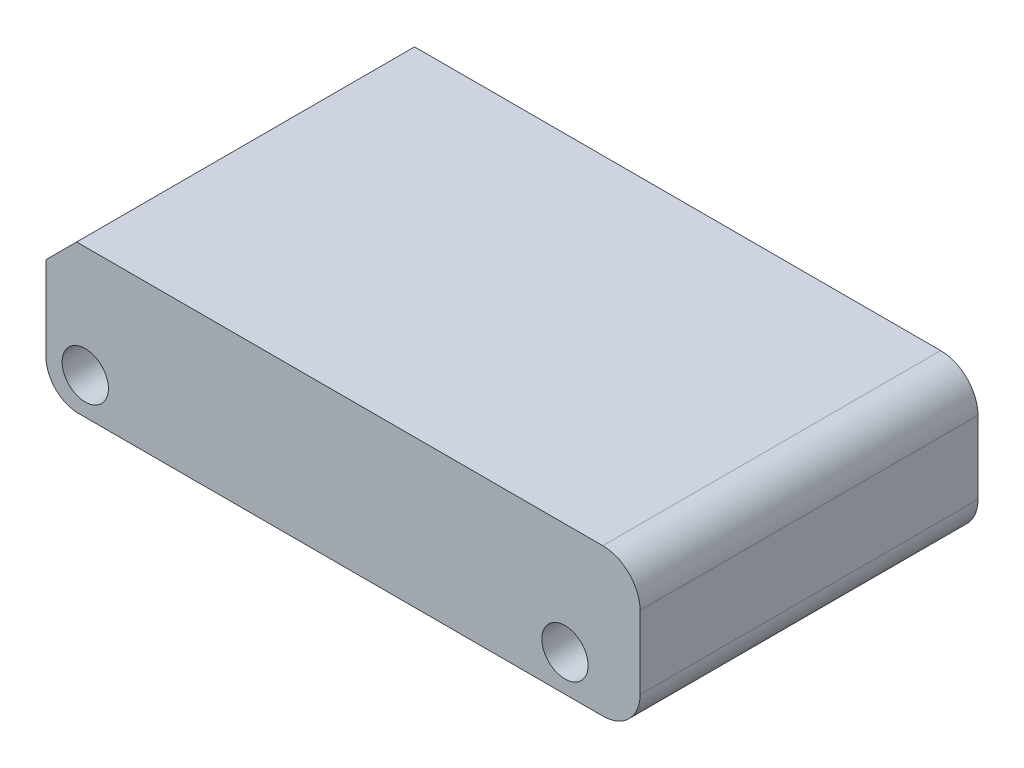
ISO-10303-21;
HEADER;
FILE_DESCRIPTION(('STEP AP214'),'2;1');
FILE_NAME('part.step','',(''),(''),'','','');
FILE_SCHEMA(('AUTOMOTIVE_DESIGN { 1 0 10303 214 1 1 1 1 }'));
ENDSEC;
DATA;
#1=APPLICATION_CONTEXT('core data for automotive mechanical design processes');
#2=APPLICATION_PROTOCOL_DEFINITION('international standard','automotive_design',2000,#1);
#3=PRODUCT_CONTEXT('',#1,'mechanical');
#4=PRODUCT('Part','Part','',(#3));
#5=PRODUCT_RELATED_PRODUCT_CATEGORY('part','',(#4));
#6=PRODUCT_DEFINITION_FORMATION('','',#4);
#7=PRODUCT_DEFINITION_CONTEXT('part definition',#1,'design');
#8=PRODUCT_DEFINITION('design','',#6,#7);
#9=PRODUCT_DEFINITION_SHAPE('','',#8);
#10=(LENGTH_UNIT() NAMED_UNIT(*) SI_UNIT(.MILLI.,.METRE.));
#11=(NAMED_UNIT(*) PLANE_ANGLE_UNIT() SI_UNIT($,.RADIAN.));
#12=(NAMED_UNIT(*) SI_UNIT($,.STERADIAN.) SOLID_ANGLE_UNIT());
#13=UNCERTAINTY_MEASURE_WITH_UNIT(LENGTH_MEASURE(1.E-05),#10,'distance_accuracy_value','');
#14=(GEOMETRIC_REPRESENTATION_CONTEXT(3) GLOBAL_UNCERTAINTY_ASSIGNED_CONTEXT((#13)) GLOBAL_UNIT_ASSIGNED_CONTEXT((#10,
#11,#12)) REPRESENTATION_CONTEXT('',''));
#15=CARTESIAN_POINT('',(0.,0.,0.));
#16=DIRECTION('',(0.,0.,1.));
#17=DIRECTION('',(1.,0.,0.));
#18=AXIS2_PLACEMENT_3D('',#15,#16,#17);
#19=CARTESIAN_POINT('',(-88.8711953616352,30.9117201257862,-93.9800000000003));
#20=DIRECTION('',(-0.707106781186548,0.707106781186548,0.));
#21=DIRECTION('',(-0.707106781186548,-0.707106781186548,0.));
#22=AXIS2_PLACEMENT_3D('',#19,#20,#21);
#23=PLANE('',#22);
#24=DIRECTION('',(-0.707106781186548,-0.707106781186548,0.));
#25=VECTOR('',#24,1.);
#26=CARTESIAN_POINT('',(-88.8711953616352,30.9117201257862,0.));
#27=LINE('',#26,#25);
#28=CARTESIAN_POINT('',(-88.8711953616352,30.9117201257862,0.));
#29=VERTEX_POINT('',#28);
#30=CARTESIAN_POINT('',(-97.3875249057969,22.3953905816245,0.));
#31=VERTEX_POINT('',#30);
#32=EDGE_CURVE('E142',#29,#31,#27,.T.);
#33=ORIENTED_EDGE('',*,*,#32,.F.);
#34=DIRECTION('',(0.,0.,1.));
#35=VECTOR('',#34,1.);
#36=CARTESIAN_POINT('',(-88.8711953616352,30.9117201257862,-93.9800000000003));
#37=LINE('',#36,#35);
#38=CARTESIAN_POINT('',(-88.8711953616352,30.9117201257862,-93.9800000000003));
#39=VERTEX_POINT('',#38);
#40=EDGE_CURVE('E11',#39,#29,#37,.T.);
#41=ORIENTED_EDGE('',*,*,#40,.F.);
#42=DIRECTION('',(-0.707106781186548,-0.707106781186548,0.));
#43=VECTOR('',#42,1.);
#44=CARTESIAN_POINT('',(-88.8711953616352,30.9117201257862,-93.9800000000003));
#45=LINE('',#44,#43);
#46=CARTESIAN_POINT('',(-97.3875249057969,22.3953905816245,-93.9800000000003));
#47=VERTEX_POINT('',#46);
#48=EDGE_CURVE('E171',#39,#47,#45,.T.);
#49=ORIENTED_EDGE('',*,*,#48,.T.);
#50=DIRECTION('',(0.,0.,1.));
#51=VECTOR('',#50,1.);
#52=CARTESIAN_POINT('',(-97.3875249057969,22.3953905816245,-93.9800000000003));
#53=LINE('',#52,#51);
#54=EDGE_CURVE('E42',#47,#31,#53,.T.);
#55=ORIENTED_EDGE('',*,*,#54,.T.);
#56=EDGE_LOOP('',(#33,#41,#49,#55));
#57=FACE_BOUND('',#56,.T.);
#58=ADVANCED_FACE('F39',(#57),#23,.T.);
#59=CARTESIAN_POINT('',(-88.8711953616352,30.9117201257862,-93.9800000000003));
#60=DIRECTION('',(0.,1.,0.));
#61=DIRECTION('',(0.,0.,1.));
#62=AXIS2_PLACEMENT_3D('',#59,#60,#61);
#63=PLANE('',#62);
#64=DIRECTION('',(-1.,0.,0.));
#65=VECTOR('',#64,1.);
#66=CARTESIAN_POINT('',(-88.8711953616352,30.9117201257862,0.));
#67=LINE('',#66,#65);
#68=CARTESIAN_POINT('',(57.4375560690458,30.9117201257862,0.));
#69=VERTEX_POINT('',#68);
#70=EDGE_CURVE('E168',#69,#29,#67,.T.);
#71=ORIENTED_EDGE('',*,*,#70,.F.);
#72=DIRECTION('',(0.,0.,1.));
#73=VECTOR('',#72,1.);
#74=CARTESIAN_POINT('',(57.4375560690458,30.9117201257862,-93.9800000000003));
#75=LINE('',#74,#73);
#76=CARTESIAN_POINT('',(57.4375560690458,30.9117201257862,-93.9800000000003));
#77=VERTEX_POINT('',#76);
#78=EDGE_CURVE('E49',#77,#69,#75,.T.);
#79=ORIENTED_EDGE('',*,*,#78,.F.);
#80=DIRECTION('',(-1.,0.,0.));
#81=VECTOR('',#80,1.);
#82=CARTESIAN_POINT('',(-88.8711953616352,30.9117201257862,-93.9800000000003));
#83=LINE('',#82,#81);
#84=EDGE_CURVE('E128',#77,#39,#83,.T.);
#85=ORIENTED_EDGE('',*,*,#84,.T.);
#86=ORIENTED_EDGE('',*,*,#40,.T.);
#87=EDGE_LOOP('',(#71,#79,#85,#86));
#88=FACE_BOUND('',#87,.T.);
#89=ADVANCED_FACE('F189',(#88),#63,.T.);
#90=CARTESIAN_POINT('',(57.4375560690459,20.5300281602409,-93.9800000000003));
#91=DIRECTION('',(0.,0.,1.));
#92=DIRECTION('',(1.,0.,0.));
#93=AXIS2_PLACEMENT_3D('',#90,#91,#92);
#94=CYLINDRICAL_SURFACE('',#93,10.3816919655453);
#95=CARTESIAN_POINT('',(57.4375560690459,20.5300281602409,0.));
#96=DIRECTION('',(0.,0.,1.));
#97=DIRECTION('',(-1.,0.,0.));
#98=AXIS2_PLACEMENT_3D('',#95,#96,#97);
#99=CIRCLE('',#98,10.3816919655453);
#100=CARTESIAN_POINT('',(67.8192480345912,20.5300281602408,0.));
#101=VERTEX_POINT('',#100);
#102=EDGE_CURVE('E114',#101,#69,#99,.T.);
#103=ORIENTED_EDGE('',*,*,#102,.F.);
#104=DIRECTION('',(0.,0.,1.));
#105=VECTOR('',#104,1.);
#106=CARTESIAN_POINT('',(67.8192480345912,20.5300281602408,-93.9800000000003));
#107=LINE('',#106,#105);
#108=CARTESIAN_POINT('',(67.8192480345912,20.5300281602408,-93.9800000000003));
#109=VERTEX_POINT('',#108);
#110=EDGE_CURVE('E109',#109,#101,#107,.T.);
#111=ORIENTED_EDGE('',*,*,#110,.F.);
#112=CARTESIAN_POINT('',(57.4375560690459,20.5300281602409,-93.9800000000003));
#113=DIRECTION('',(0.,0.,1.));
#114=DIRECTION('',(-1.,0.,0.));
#115=AXIS2_PLACEMENT_3D('',#112,#113,#114);
#116=CIRCLE('',#115,10.3816919655453);
#117=EDGE_CURVE('E112',#109,#77,#116,.T.);
#118=ORIENTED_EDGE('',*,*,#117,.T.);
#119=ORIENTED_EDGE('',*,*,#78,.T.);
#120=EDGE_LOOP('',(#103,#111,#118,#119));
#121=FACE_BOUND('',#120,.T.);
#122=ADVANCED_FACE('F111',(#121),#94,.T.);
#123=CARTESIAN_POINT('',(67.8192480345912,20.5300281602408,-93.9800000000003));
#124=DIRECTION('',(1.,0.,0.));
#125=DIRECTION('',(0.,0.,-1.));
#126=AXIS2_PLACEMENT_3D('',#123,#124,#125);
#127=PLANE('',#126);
#128=DIRECTION('',(0.,1.,0.));
#129=VECTOR('',#128,1.);
#130=CARTESIAN_POINT('',(67.8192480345912,20.5300281602408,0.));
#131=LINE('',#130,#129);
#132=CARTESIAN_POINT('',(67.8192480345912,0.255438820891287,0.));
#133=VERTEX_POINT('',#132);
#134=EDGE_CURVE('E163',#133,#101,#131,.T.);
#135=ORIENTED_EDGE('',*,*,#134,.F.);
#136=DIRECTION('',(0.,0.,1.));
#137=VECTOR('',#136,1.);
#138=CARTESIAN_POINT('',(67.8192480345912,0.255438820891287,-93.9800000000003));
#139=LINE('',#138,#137);
#140=CARTESIAN_POINT('',(67.8192480345912,0.255438820891287,-93.9800000000003));
#141=VERTEX_POINT('',#140);
#142=EDGE_CURVE('E120',#141,#133,#139,.T.);
#143=ORIENTED_EDGE('',*,*,#142,.F.);
#144=DIRECTION('',(0.,1.,0.));
#145=VECTOR('',#144,1.);
#146=CARTESIAN_POINT('',(67.8192480345912,20.5300281602408,-93.9800000000003));
#147=LINE('',#146,#145);
#148=EDGE_CURVE('E126',#141,#109,#147,.T.);
#149=ORIENTED_EDGE('',*,*,#148,.T.);
#150=ORIENTED_EDGE('',*,*,#110,.T.);
#151=EDGE_LOOP('',(#135,#143,#149,#150));
#152=FACE_BOUND('',#151,.T.);
#153=ADVANCED_FACE('F131',(#152),#127,.T.);
#154=CARTESIAN_POINT('',(57.4375560690459,0.255438820891211,-93.9800000000003));
#155=DIRECTION('',(0.,0.,1.));
#156=DIRECTION('',(1.,0.,0.));
#157=AXIS2_PLACEMENT_3D('',#154,#155,#156);
#158=CYLINDRICAL_SURFACE('',#157,10.3816919655453);
#159=CARTESIAN_POINT('',(57.4375560690459,0.255438820891211,0.));
#160=DIRECTION('',(0.,0.,1.));
#161=DIRECTION('',(1.,0.,0.));
#162=AXIS2_PLACEMENT_3D('',#159,#160,#161);
#163=CIRCLE('',#162,10.3816919655453);
#164=CARTESIAN_POINT('',(57.4375560690458,-10.1262531446541,0.));
#165=VERTEX_POINT('',#164);
#166=EDGE_CURVE('E159',#165,#133,#163,.T.);
#167=ORIENTED_EDGE('',*,*,#166,.F.);
#168=DIRECTION('',(0.,0.,1.));
#169=VECTOR('',#168,1.);
#170=CARTESIAN_POINT('',(57.4375560690458,-10.1262531446541,-93.9800000000003));
#171=LINE('',#170,#169);
#172=CARTESIAN_POINT('',(57.4375560690458,-10.1262531446541,-93.9800000000003));
#173=VERTEX_POINT('',#172);
#174=EDGE_CURVE('E177',#173,#165,#171,.T.);
#175=ORIENTED_EDGE('',*,*,#174,.F.);
#176=CARTESIAN_POINT('',(57.4375560690459,0.255438820891211,-93.9800000000003));
#177=DIRECTION('',(0.,0.,1.));
#178=DIRECTION('',(1.,0.,0.));
#179=AXIS2_PLACEMENT_3D('',#176,#177,#178);
#180=CIRCLE('',#179,10.3816919655453);
#181=EDGE_CURVE('E133',#173,#141,#180,.T.);
#182=ORIENTED_EDGE('',*,*,#181,.T.);
#183=ORIENTED_EDGE('',*,*,#142,.T.);
#184=EDGE_LOOP('',(#167,#175,#182,#183));
#185=FACE_BOUND('',#184,.T.);
#186=ADVANCED_FACE('F202',(#185),#158,.T.);
#187=CARTESIAN_POINT('',(-88.3271931447905,-10.1262531446541,-93.9800000000003));
#188=DIRECTION('',(0.,-1.,0.));
#189=DIRECTION('',(1.,0.,0.));
#190=AXIS2_PLACEMENT_3D('',#187,#188,#189);
#191=PLANE('',#190);
#192=DIRECTION('',(1.,0.,0.));
#193=VECTOR('',#192,1.);
#194=CARTESIAN_POINT('',(-88.3271931447905,-10.1262531446541,0.));
#195=LINE('',#194,#193);
#196=CARTESIAN_POINT('',(-88.3271931447905,-10.1262531446541,0.));
#197=VERTEX_POINT('',#196);
#198=EDGE_CURVE('E155',#197,#165,#195,.T.);
#199=ORIENTED_EDGE('',*,*,#198,.F.);
#200=DIRECTION('',(0.,0.,1.));
#201=VECTOR('',#200,1.);
#202=CARTESIAN_POINT('',(-88.3271931447905,-10.1262531446541,-93.9800000000003));
#203=LINE('',#202,#201);
#204=CARTESIAN_POINT('',(-88.3271931447905,-10.1262531446541,-93.9800000000003));
#205=VERTEX_POINT('',#204);
#206=EDGE_CURVE('E180',#205,#197,#203,.T.);
#207=ORIENTED_EDGE('',*,*,#206,.F.);
#208=DIRECTION('',(1.,0.,0.));
#209=VECTOR('',#208,1.);
#210=CARTESIAN_POINT('',(-88.3271931447905,-10.1262531446541,-93.9800000000003));
#211=LINE('',#210,#209);
#212=EDGE_CURVE('E136',#205,#173,#211,.T.);
#213=ORIENTED_EDGE('',*,*,#212,.T.);
#214=ORIENTED_EDGE('',*,*,#174,.T.);
#215=EDGE_LOOP('',(#199,#207,#213,#214));
#216=FACE_BOUND('',#215,.T.);
#217=ADVANCED_FACE('F205',(#216),#191,.T.);
#218=CARTESIAN_POINT('',(-88.3271931447905,-1.06592138364773,-93.9800000000003));
#219=DIRECTION('',(0.,0.,1.));
#220=DIRECTION('',(1.,0.,0.));
#221=AXIS2_PLACEMENT_3D('',#218,#219,#220);
#222=CYLINDRICAL_SURFACE('',#221,9.06033176100637);
#223=CARTESIAN_POINT('',(-88.3271931447905,-1.06592138364773,0.));
#224=DIRECTION('',(0.,0.,1.));
#225=DIRECTION('',(1.,0.,0.));
#226=AXIS2_PLACEMENT_3D('',#223,#224,#225);
#227=CIRCLE('',#226,9.06033176100637);
#228=CARTESIAN_POINT('',(-97.3875249057969,-1.06592138364773,0.));
#229=VERTEX_POINT('',#228);
#230=EDGE_CURVE('E151',#229,#197,#227,.T.);
#231=ORIENTED_EDGE('',*,*,#230,.F.);
#232=DIRECTION('',(0.,0.,1.));
#233=VECTOR('',#232,1.);
#234=CARTESIAN_POINT('',(-97.3875249057969,-1.06592138364773,-93.9800000000003));
#235=LINE('',#234,#233);
#236=CARTESIAN_POINT('',(-97.3875249057969,-1.06592138364773,-93.9800000000003));
#237=VERTEX_POINT('',#236);
#238=EDGE_CURVE('E182',#237,#229,#235,.T.);
#239=ORIENTED_EDGE('',*,*,#238,.F.);
#240=CARTESIAN_POINT('',(-88.3271931447905,-1.06592138364773,-93.9800000000003));
#241=DIRECTION('',(0.,0.,1.));
#242=DIRECTION('',(1.,0.,0.));
#243=AXIS2_PLACEMENT_3D('',#240,#241,#242);
#244=CIRCLE('',#243,9.06033176100637);
#245=EDGE_CURVE('E257',#237,#205,#244,.T.);
#246=ORIENTED_EDGE('',*,*,#245,.T.);
#247=ORIENTED_EDGE('',*,*,#206,.T.);
#248=EDGE_LOOP('',(#231,#239,#246,#247));
#249=FACE_BOUND('',#248,.T.);
#250=ADVANCED_FACE('F209',(#249),#222,.T.);
#251=CARTESIAN_POINT('',(-97.3875249057969,22.3953905816245,-93.9800000000003));
#252=DIRECTION('',(-1.,0.,0.));
#253=DIRECTION('',(0.,0.,1.));
#254=AXIS2_PLACEMENT_3D('',#251,#252,#253);
#255=PLANE('',#254);
#256=DIRECTION('',(0.,-1.,0.));
#257=VECTOR('',#256,1.);
#258=CARTESIAN_POINT('',(-97.3875249057969,22.3953905816245,0.));
#259=LINE('',#258,#257);
#260=EDGE_CURVE('E146',#31,#229,#259,.T.);
#261=ORIENTED_EDGE('',*,*,#260,.F.);
#262=ORIENTED_EDGE('',*,*,#54,.F.);
#263=DIRECTION('',(0.,-1.,0.));
#264=VECTOR('',#263,1.);
#265=CARTESIAN_POINT('',(-97.3875249057969,22.3953905816245,-93.9800000000003));
#266=LINE('',#265,#264);
#267=EDGE_CURVE('E254',#47,#237,#266,.T.);
#268=ORIENTED_EDGE('',*,*,#267,.T.);
#269=ORIENTED_EDGE('',*,*,#238,.T.);
#270=EDGE_LOOP('',(#261,#262,#268,#269));
#271=FACE_BOUND('',#270,.T.);
#272=ADVANCED_FACE('F186',(#271),#255,.T.);
#273=CARTESIAN_POINT('',(-88.3271931447905,-1.06592138364773,-93.9800000000003));
#274=DIRECTION('',(0.,0.,1.));
#275=DIRECTION('',(1.,0.,0.));
#276=AXIS2_PLACEMENT_3D('',#273,#274,#275);
#277=PLANE('',#276);
#278=CARTESIAN_POINT('',(46.9390647327295,0.,-93.9800000000003));
#279=DIRECTION('',(0.,0.,1.));
#280=DIRECTION('',(1.,0.,0.));
#281=AXIS2_PLACEMENT_3D('',#278,#279,#280);
#282=CIRCLE('',#281,6.43978854142695);
#283=CARTESIAN_POINT('',(53.3788532741565,0.,-93.9800000000003));
#284=VERTEX_POINT('',#283);
#285=EDGE_CURVE('E236',#284,#284,#282,.T.);
#286=ORIENTED_EDGE('',*,*,#285,.T.);
#287=EDGE_LOOP('',(#286));
#288=FACE_BOUND('',#287,.T.);
#289=CARTESIAN_POINT('',(-86.4728722484277,0.,-93.9800000000003));
#290=DIRECTION('',(0.,0.,1.));
#291=DIRECTION('',(1.,0.,0.));
#292=AXIS2_PLACEMENT_3D('',#289,#290,#291);
#293=CIRCLE('',#292,6.43978854142695);
#294=CARTESIAN_POINT('',(-80.0330837070007,0.,-93.9800000000003));
#295=VERTEX_POINT('',#294);
#296=EDGE_CURVE('E147',#295,#295,#293,.T.);
#297=ORIENTED_EDGE('',*,*,#296,.T.);
#298=EDGE_LOOP('',(#297));
#299=FACE_BOUND('',#298,.T.);
#300=ORIENTED_EDGE('',*,*,#48,.F.);
#301=ORIENTED_EDGE('',*,*,#84,.F.);
#302=ORIENTED_EDGE('',*,*,#117,.F.);
#303=ORIENTED_EDGE('',*,*,#148,.F.);
#304=ORIENTED_EDGE('',*,*,#181,.F.);
#305=ORIENTED_EDGE('',*,*,#212,.F.);
#306=ORIENTED_EDGE('',*,*,#245,.F.);
#307=ORIENTED_EDGE('',*,*,#267,.F.);
#308=EDGE_LOOP('',(#300,#301,#302,#303,#304,#305,#306,#307));
#309=FACE_BOUND('',#308,.T.);
#310=ADVANCED_FACE('F124',(#288,#299,#309),#277,.F.);
#311=CARTESIAN_POINT('',(-88.3271931447905,-1.06592138364773,0.));
#312=DIRECTION('',(0.,0.,1.));
#313=DIRECTION('',(1.,0.,0.));
#314=AXIS2_PLACEMENT_3D('',#311,#312,#313);
#315=PLANE('',#314);
#316=CARTESIAN_POINT('',(46.9390647327295,0.,0.));
#317=DIRECTION('',(0.,0.,1.));
#318=DIRECTION('',(1.,0.,0.));
#319=AXIS2_PLACEMENT_3D('',#316,#317,#318);
#320=CIRCLE('',#319,6.43978854142695);
#321=CARTESIAN_POINT('',(53.3788532741565,0.,0.));
#322=VERTEX_POINT('',#321);
#323=EDGE_CURVE('E239',#322,#322,#320,.T.);
#324=ORIENTED_EDGE('',*,*,#323,.F.);
#325=EDGE_LOOP('',(#324));
#326=FACE_BOUND('',#325,.T.);
#327=CARTESIAN_POINT('',(-86.4728722484277,0.,0.));
#328=DIRECTION('',(0.,0.,1.));
#329=DIRECTION('',(1.,0.,0.));
#330=AXIS2_PLACEMENT_3D('',#327,#328,#329);
#331=CIRCLE('',#330,6.43978854142695);
#332=CARTESIAN_POINT('',(-80.0330837070007,0.,0.));
#333=VERTEX_POINT('',#332);
#334=EDGE_CURVE('E243',#333,#333,#331,.T.);
#335=ORIENTED_EDGE('',*,*,#334,.F.);
#336=EDGE_LOOP('',(#335));
#337=FACE_BOUND('',#336,.T.);
#338=ORIENTED_EDGE('',*,*,#32,.T.);
#339=ORIENTED_EDGE('',*,*,#260,.T.);
#340=ORIENTED_EDGE('',*,*,#230,.T.);
#341=ORIENTED_EDGE('',*,*,#198,.T.);
#342=ORIENTED_EDGE('',*,*,#166,.T.);
#343=ORIENTED_EDGE('',*,*,#134,.T.);
#344=ORIENTED_EDGE('',*,*,#102,.T.);
#345=ORIENTED_EDGE('',*,*,#70,.T.);
#346=EDGE_LOOP('',(#338,#339,#340,#341,#342,#343,#344,#345));
#347=FACE_BOUND('',#346,.T.);
#348=ADVANCED_FACE('F188',(#326,#337,#347),#315,.T.);
#349=CARTESIAN_POINT('',(-86.4728722484277,0.,-93.9800000000003));
#350=DIRECTION('',(0.,0.,1.));
#351=DIRECTION('',(1.,0.,0.));
#352=AXIS2_PLACEMENT_3D('',#349,#350,#351);
#353=CYLINDRICAL_SURFACE('',#352,6.43978854142695);
#354=ORIENTED_EDGE('',*,*,#296,.F.);
#355=EDGE_LOOP('',(#354));
#356=FACE_BOUND('',#355,.T.);
#357=ORIENTED_EDGE('',*,*,#334,.T.);
#358=EDGE_LOOP('',(#357));
#359=FACE_BOUND('',#358,.T.);
#360=ADVANCED_FACE('F221',(#356,#359),#353,.F.);
#361=CARTESIAN_POINT('',(46.9390647327295,0.,-93.9800000000003));
#362=DIRECTION('',(0.,0.,1.));
#363=DIRECTION('',(1.,0.,0.));
#364=AXIS2_PLACEMENT_3D('',#361,#362,#363);
#365=CYLINDRICAL_SURFACE('',#364,6.43978854142695);
#366=ORIENTED_EDGE('',*,*,#285,.F.);
#367=EDGE_LOOP('',(#366));
#368=FACE_BOUND('',#367,.T.);
#369=ORIENTED_EDGE('',*,*,#323,.T.);
#370=EDGE_LOOP('',(#369));
#371=FACE_BOUND('',#370,.T.);
#372=ADVANCED_FACE('F228',(#368,#371),#365,.F.);
#373=CLOSED_SHELL('',(#58,#89,#122,#153,#186,#217,#250,#272,#310,#348,#360,#372));
#374=MANIFOLD_SOLID_BREP('B2',#373);
#375=ADVANCED_BREP_SHAPE_REPRESENTATION('',(#18,#374),#14);
#376=SHAPE_DEFINITION_REPRESENTATION(#9,#375);
ENDSEC;
END-ISO-10303-21;
